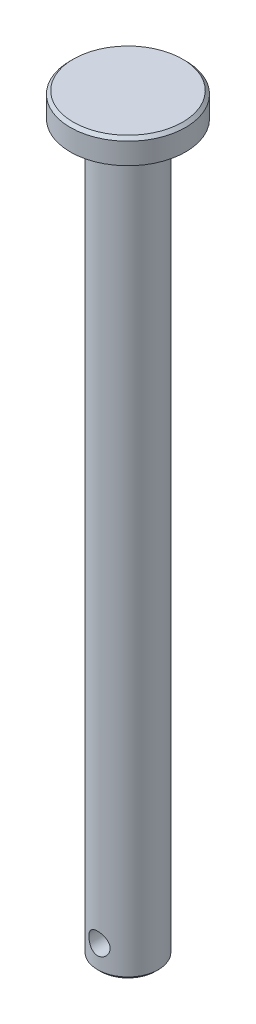
ISO-10303-21;
HEADER;
FILE_DESCRIPTION(('STEP AP214'),'2;1');
FILE_NAME('part.step','',(''),(''),'','','');
FILE_SCHEMA(('AUTOMOTIVE_DESIGN { 1 0 10303 214 1 1 1 1 }'));
ENDSEC;
DATA;
#1=APPLICATION_CONTEXT('core data for automotive mechanical design processes');
#2=APPLICATION_PROTOCOL_DEFINITION('international standard','automotive_design',2000,#1);
#3=PRODUCT_CONTEXT('',#1,'mechanical');
#4=PRODUCT('Part','Part','',(#3));
#5=PRODUCT_RELATED_PRODUCT_CATEGORY('part','',(#4));
#6=PRODUCT_DEFINITION_FORMATION('','',#4);
#7=PRODUCT_DEFINITION_CONTEXT('part definition',#1,'design');
#8=PRODUCT_DEFINITION('design','',#6,#7);
#9=PRODUCT_DEFINITION_SHAPE('','',#8);
#10=(LENGTH_UNIT() NAMED_UNIT(*) SI_UNIT(.MILLI.,.METRE.));
#11=(NAMED_UNIT(*) PLANE_ANGLE_UNIT() SI_UNIT($,.RADIAN.));
#12=(NAMED_UNIT(*) SI_UNIT($,.STERADIAN.) SOLID_ANGLE_UNIT());
#13=UNCERTAINTY_MEASURE_WITH_UNIT(LENGTH_MEASURE(1.E-05),#10,'distance_accuracy_value','');
#14=(GEOMETRIC_REPRESENTATION_CONTEXT(3) GLOBAL_UNCERTAINTY_ASSIGNED_CONTEXT((#13)) GLOBAL_UNIT_ASSIGNED_CONTEXT((#10,
#11,#12)) REPRESENTATION_CONTEXT('',''));
#15=CARTESIAN_POINT('',(0.,0.,0.));
#16=DIRECTION('',(0.,0.,1.));
#17=DIRECTION('',(1.,0.,0.));
#18=AXIS2_PLACEMENT_3D('',#15,#16,#17);
#19=CARTESIAN_POINT('',(0.,123.35,0.));
#20=DIRECTION('',(0.,-1.,0.));
#21=DIRECTION('',(0.,0.,-1.));
#22=AXIS2_PLACEMENT_3D('',#19,#20,#21);
#23=PLANE('',#22);
#24=CARTESIAN_POINT('',(0.,123.35,0.));
#25=DIRECTION('',(0.,1.,0.));
#26=DIRECTION('',(0.,0.,1.));
#27=AXIS2_PLACEMENT_3D('',#24,#25,#26);
#28=CIRCLE('',#27,18.);
#29=CARTESIAN_POINT('',(0.,123.35,18.0000000000001));
#30=VERTEX_POINT('',#29);
#31=EDGE_CURVE('E10',#30,#30,#28,.T.);
#32=ORIENTED_EDGE('',*,*,#31,.T.);
#33=EDGE_LOOP('',(#32));
#34=FACE_BOUND('',#33,.T.);
#35=ADVANCED_FACE('F37',(#34),#23,.F.);
#36=CARTESIAN_POINT('',(0.,122.35,0.));
#37=DIRECTION('',(0.,-1.,0.));
#38=DIRECTION('',(0.,0.,-1.));
#39=AXIS2_PLACEMENT_3D('',#36,#37,#38);
#40=CONICAL_SURFACE('',#39,19.,0.785398163397448);
#41=ORIENTED_EDGE('',*,*,#31,.F.);
#42=EDGE_LOOP('',(#41));
#43=FACE_BOUND('',#42,.T.);
#44=CARTESIAN_POINT('',(0.,122.35,0.));
#45=DIRECTION('',(0.,1.,0.));
#46=DIRECTION('',(0.,0.,1.));
#47=AXIS2_PLACEMENT_3D('',#44,#45,#46);
#48=CIRCLE('',#47,19.);
#49=CARTESIAN_POINT('',(0.,122.35,19.0000000000001));
#50=VERTEX_POINT('',#49);
#51=EDGE_CURVE('E49',#50,#50,#48,.T.);
#52=ORIENTED_EDGE('',*,*,#51,.T.);
#53=EDGE_LOOP('',(#52));
#54=FACE_BOUND('',#53,.T.);
#55=ADVANCED_FACE('F87',(#43,#54),#40,.T.);
#56=CARTESIAN_POINT('',(0.,123.35,0.));
#57=DIRECTION('',(0.,1.,0.));
#58=DIRECTION('',(0.,0.,1.));
#59=AXIS2_PLACEMENT_3D('',#56,#57,#58);
#60=CYLINDRICAL_SURFACE('',#59,19.);
#61=ORIENTED_EDGE('',*,*,#51,.F.);
#62=EDGE_LOOP('',(#61));
#63=FACE_BOUND('',#62,.T.);
#64=CARTESIAN_POINT('',(0.,115.35,0.));
#65=DIRECTION('',(0.,1.,0.));
#66=DIRECTION('',(0.,0.,1.));
#67=AXIS2_PLACEMENT_3D('',#64,#65,#66);
#68=CIRCLE('',#67,19.);
#69=CARTESIAN_POINT('',(0.,115.35,19.0000000000001));
#70=VERTEX_POINT('',#69);
#71=EDGE_CURVE('E54',#70,#70,#68,.T.);
#72=ORIENTED_EDGE('',*,*,#71,.T.);
#73=EDGE_LOOP('',(#72));
#74=FACE_BOUND('',#73,.T.);
#75=ADVANCED_FACE('F91',(#63,#74),#60,.T.);
#76=CARTESIAN_POINT('',(0.,115.35,-19.));
#77=DIRECTION('',(0.,1.,0.));
#78=DIRECTION('',(0.,0.,1.));
#79=AXIS2_PLACEMENT_3D('',#76,#77,#78);
#80=PLANE('',#79);
#81=ORIENTED_EDGE('',*,*,#71,.F.);
#82=EDGE_LOOP('',(#81));
#83=FACE_BOUND('',#82,.T.);
#84=CARTESIAN_POINT('',(0.,115.35,0.));
#85=DIRECTION('',(0.,1.,0.));
#86=DIRECTION('',(0.,0.,1.));
#87=AXIS2_PLACEMENT_3D('',#84,#85,#86);
#88=CIRCLE('',#87,10.);
#89=CARTESIAN_POINT('',(0.,115.35,10.0000000000001));
#90=VERTEX_POINT('',#89);
#91=EDGE_CURVE('E107',#90,#90,#88,.T.);
#92=ORIENTED_EDGE('',*,*,#91,.T.);
#93=EDGE_LOOP('',(#92));
#94=FACE_BOUND('',#93,.T.);
#95=ADVANCED_FACE('F82',(#83,#94),#80,.F.);
#96=CARTESIAN_POINT('',(0.,123.35,0.));
#97=DIRECTION('',(0.,1.,0.));
#98=DIRECTION('',(0.,0.,1.));
#99=AXIS2_PLACEMENT_3D('',#96,#97,#98);
#100=CYLINDRICAL_SURFACE('',#99,10.);
#101=CARTESIAN_POINT('',(0.,-118.35,10.0000000000001));
#102=CARTESIAN_POINT('',(-0.190419365667703,-118.350002956649,10.0000020746621));
#103=CARTESIAN_POINT('',(-0.38081762160574,-118.334410328595,9.99451197787152));
#104=CARTESIAN_POINT('',(-0.755973359168908,-118.272666206838,9.97315454250201));
#105=CARTESIAN_POINT('',(-0.940730815616032,-118.226514576755,9.95728715761059));
#106=CARTESIAN_POINT('',(-1.29914235601609,-118.105451061498,9.91689126922372));
#107=CARTESIAN_POINT('',(-1.47281549375808,-118.030590170228,9.89237812863989));
#108=CARTESIAN_POINT('',(-1.80513664529484,-117.854474888736,9.83716899731461));
#109=CARTESIAN_POINT('',(-1.96378123246314,-117.753214498877,9.80647160147961));
#110=CARTESIAN_POINT('',(-2.26752589205325,-117.523171484349,9.74080617360312));
#111=CARTESIAN_POINT('',(-2.41198196476038,-117.393570081778,9.70572841777014));
#112=CARTESIAN_POINT('',(-2.67761185151262,-117.112263331053,9.63583394944028));
#113=CARTESIAN_POINT('',(-2.79877980873016,-116.960552439313,9.60101730472151));
#114=CARTESIAN_POINT('',(-3.01822956436078,-116.633345350441,9.53435354213106));
#115=CARTESIAN_POINT('',(-3.11564633061597,-116.45723944154,9.50263856119584));
#116=CARTESIAN_POINT('',(-3.27919932284536,-116.089855409709,9.44745244346266));
#117=CARTESIAN_POINT('',(-3.34534622118704,-115.898582489326,9.42397849471551));
#118=CARTESIAN_POINT('',(-3.442016393275,-115.513656967317,9.38909436352048));
#119=CARTESIAN_POINT('',(-3.47375567154242,-115.320348102858,9.37727382728356));
#120=CARTESIAN_POINT('',(-3.5045119777418,-114.930814881086,9.36582571885885));
#121=CARTESIAN_POINT('',(-3.50354037655207,-114.734591560598,9.36619390965393));
#122=CARTESIAN_POINT('',(-3.46984099899521,-114.355450541086,9.37872426808744));
#123=CARTESIAN_POINT('',(-3.43873715098197,-114.172365019623,9.39028330321848));
#124=CARTESIAN_POINT('',(-3.34831908308157,-113.814197593617,9.42290004435321));
#125=CARTESIAN_POINT('',(-3.2890011577967,-113.639116743653,9.44395899797692));
#126=CARTESIAN_POINT('',(-3.14284371093642,-113.298387633251,9.49360610743072));
#127=CARTESIAN_POINT('',(-3.05554665446728,-113.13295444866,9.52231799264184));
#128=CARTESIAN_POINT('',(-2.8562268850267,-112.818588051007,9.58398812877159));
#129=CARTESIAN_POINT('',(-2.74419646122599,-112.669660005354,9.61694770260504));
#130=CARTESIAN_POINT('',(-2.49093399518728,-112.383456771633,9.68573241314932));
#131=CARTESIAN_POINT('',(-2.34838607842094,-112.247356750452,9.72161293244879));
#132=CARTESIAN_POINT('',(-2.04205684725532,-112.00067012811,9.79053740803585));
#133=CARTESIAN_POINT('',(-1.87827306050323,-111.890086501829,9.82358103329678));
#134=CARTESIAN_POINT('',(-1.53143472911856,-111.696494008746,9.88362313366396));
#135=CARTESIAN_POINT('',(-1.34817380341042,-111.613829437555,9.91054487994613));
#136=CARTESIAN_POINT('',(-0.969175142974263,-111.480877693133,9.95474882353592));
#137=CARTESIAN_POINT('',(-0.773442238836897,-111.430578067228,9.97203472796913));
#138=CARTESIAN_POINT('',(-0.384982043681423,-111.365934186578,9.99439060162877));
#139=CARTESIAN_POINT('',(-0.192549298627005,-111.350004193481,9.99999889165438));
#140=CARTESIAN_POINT('',(0.192296486438431,-111.349995810658,10.0000011069649));
#141=CARTESIAN_POINT('',(0.384709523316249,-111.36591141143,9.99439714808528));
#142=CARTESIAN_POINT('',(0.757512294713571,-111.427905349904,9.97296032320407));
#143=CARTESIAN_POINT('',(0.938089527398881,-111.472985137734,9.95746630824318));
#144=CARTESIAN_POINT('',(1.28902504417686,-111.590753814901,9.9181459010926));
#145=CARTESIAN_POINT('',(1.45938200269866,-111.663446276679,9.89431843077806));
#146=CARTESIAN_POINT('',(1.790306794606,-111.836590088631,9.83990425287687));
#147=CARTESIAN_POINT('',(1.95047324127449,-111.937753984704,9.80914873431535));
#148=CARTESIAN_POINT('',(2.25205778758365,-112.164145179573,9.74433517467026));
#149=CARTESIAN_POINT('',(2.39346963572598,-112.289380468224,9.71027603890417));
#150=CARTESIAN_POINT('',(2.66095315380392,-112.567800201614,9.64050839724215));
#151=CARTESIAN_POINT('',(2.7858945116179,-112.722074107977,9.60480315581253));
#152=CARTESIAN_POINT('',(3.00828742625728,-113.0501458994,9.53749178690702));
#153=CARTESIAN_POINT('',(3.10573801857336,-113.223944469181,9.50588580327396));
#154=CARTESIAN_POINT('',(3.27010981479248,-113.586667290207,9.4506055494948));
#155=CARTESIAN_POINT('',(3.33703039732226,-113.775591849218,9.42693144078769));
#156=CARTESIAN_POINT('',(3.43775166187451,-114.163065453886,9.39067542064758));
#157=CARTESIAN_POINT('',(3.47156933803391,-114.361609506153,9.37808781803521));
#158=CARTESIAN_POINT('',(3.50371939295706,-114.750620321542,9.36612061036581));
#159=CARTESIAN_POINT('',(3.50394730780741,-114.940910296685,9.36603546801151));
#160=CARTESIAN_POINT('',(3.47365100022855,-115.318662623158,9.37731326834135));
#161=CARTESIAN_POINT('',(3.44312898727853,-115.506125176664,9.38867538850361));
#162=CARTESIAN_POINT('',(3.35359653138477,-115.868550958743,9.42101694008909));
#163=CARTESIAN_POINT('',(3.29526105722089,-116.04370296668,9.44176794542056));
#164=CARTESIAN_POINT('',(3.15232119578642,-116.381858094807,9.49044489662172));
#165=CARTESIAN_POINT('',(3.0677106267727,-116.544858344848,9.51837253067028));
#166=CARTESIAN_POINT('',(2.86997020698606,-116.862434575392,9.5798987569115));
#167=CARTESIAN_POINT('',(2.75568240723705,-117.016249400201,9.61370284993353));
#168=CARTESIAN_POINT('',(2.50372401134065,-117.303127628683,9.68237561466651));
#169=CARTESIAN_POINT('',(2.36604648644048,-117.436184860852,9.71724459931314));
#170=CARTESIAN_POINT('',(2.0638531650368,-117.683783781714,9.78598669527189));
#171=CARTESIAN_POINT('',(1.89841397862823,-117.797234450509,9.81974595569719));
#172=CARTESIAN_POINT('',(1.54966762908333,-117.99462349528,9.88078026171577));
#173=CARTESIAN_POINT('',(1.36636283652995,-118.078565779924,9.90805616593685));
#174=CARTESIAN_POINT('',(0.989029837726598,-118.213257219041,9.95276281016505));
#175=CARTESIAN_POINT('',(0.795139546253167,-118.26435660857,9.97029715080668));
#176=CARTESIAN_POINT('',(0.400823491605332,-118.332720485005,9.99391263716047));
#177=CARTESIAN_POINT('',(0.200400055490109,-118.34999688838,9.99999781659617));
#178=CARTESIAN_POINT('',(0.,-118.35,10.0000000000001));
#179=B_SPLINE_CURVE_WITH_KNOTS('',3,(#101,#102,#103,#104,#105,#106,#107,#108,#109,#110,#111,
#112,#113,#114,#115,#116,#117,#118,#119,#120,#121,#122,#123,#124,#125,#126,#127,#128,#129,#130,
#131,#132,#133,#134,#135,#136,#137,#138,#139,#140,#141,#142,#143,#144,#145,#146,#147,#148,#149,
#150,#151,#152,#153,#154,#155,#156,#157,#158,#159,#160,#161,#162,#163,#164,#165,#166,#167,#168,
#169,#170,#171,#172,#173,#174,#175,#176,#177,#178),.UNSPECIFIED.,.T.,.F.,(4,2,2,2,2,2,2,2,2,2,2,
2,2,2,2,2,2,2,2,2,2,2,2,2,2,2,2,2,2,2,2,2,2,2,2,2,2,2,4),(0.,0.570519944031418,1.14104243423654,
1.71055621088201,2.28019953012127,2.86921290102946,3.45837421214186,4.06655384480433,
4.67452575637786,5.26023033916308,5.84573132281353,6.40133800538017,6.95701767677413,
7.5222923800419,8.08774356179833,8.68595781382783,9.28424177465472,9.88965514245499,
10.4948354330496,11.0714375543579,11.6479308767879,12.2056613710878,12.7634640474098,
13.336703777142,13.9101341080364,14.5124257563887,15.1147385334242,15.7170635687055,
16.319079224177,16.8871081579754,17.4550962800157,18.0099524936405,18.5649393473461,
19.1461307089424,19.7274945383823,20.3347978040911,20.9420205963009,21.542655573071,
22.143078896829),.UNSPECIFIED.);
#180=CARTESIAN_POINT('',(0.,-118.35,10.0000000000001));
#181=VERTEX_POINT('',#180);
#182=EDGE_CURVE('E40',#181,#181,#179,.T.);
#183=ORIENTED_EDGE('',*,*,#182,.T.);
#184=EDGE_LOOP('',(#183));
#185=FACE_BOUND('',#184,.T.);
#186=CARTESIAN_POINT('',(3.5,-114.85,-9.36749699759761));
#187=CARTESIAN_POINT('',(3.50000305653412,-114.659984771557,-9.36749440971919));
#188=CARTESIAN_POINT('',(3.48447405691784,-114.469990833718,-9.37334161385507));
#189=CARTESIAN_POINT('',(3.42300568686183,-114.095670773122,-9.39596107926461));
#190=CARTESIAN_POINT('',(3.37706378968547,-113.911345122623,-9.41273424827747));
#191=CARTESIAN_POINT('',(3.25661257103421,-113.553853316391,-9.45507797616444));
#192=CARTESIAN_POINT('',(3.18216395043216,-113.380664355695,-9.48062983032267));
#193=CARTESIAN_POINT('',(3.00702321848339,-113.049173232595,-9.537623564291));
#194=CARTESIAN_POINT('',(2.90632443475545,-112.89087486909,-9.56906694106175));
#195=CARTESIAN_POINT('',(2.67688293965062,-112.586821383217,-9.63582342492188));
#196=CARTESIAN_POINT('',(2.54719487518731,-112.441802156163,-9.67123996185277));
#197=CARTESIAN_POINT('',(2.26546916251154,-112.175062505967,-9.74108253834276));
#198=CARTESIAN_POINT('',(2.11342750418821,-112.053346272292,-9.77550839885224));
#199=CARTESIAN_POINT('',(1.78585018605226,-111.83324987108,-9.84070055714599));
#200=CARTESIAN_POINT('',(1.60975957407365,-111.735651909924,-9.87133119900492));
#201=CARTESIAN_POINT('',(1.2424014342135,-111.571760382251,-9.9242536024426));
#202=CARTESIAN_POINT('',(1.05113846528143,-111.505457453592,-9.94654785749863));
#203=CARTESIAN_POINT('',(0.666588882256222,-111.408566422524,-9.97955234395668));
#204=CARTESIAN_POINT('',(0.473656238100808,-111.376715254948,-9.99067110510591));
#205=CARTESIAN_POINT('',(0.0848856021438181,-111.345603824681,-10.0015281495066));
#206=CARTESIAN_POINT('',(-0.110951549876003,-111.346334318445,-10.0012696605286));
#207=CARTESIAN_POINT('',(-0.490988541369924,-111.379589616345,-9.98967164690015));
#208=CARTESIAN_POINT('',(-0.675325714390918,-111.410740030338,-9.97881113553876));
#209=CARTESIAN_POINT('',(-1.03596846192583,-111.501663027923,-9.9478411735745));
#210=CARTESIAN_POINT('',(-1.21227347889997,-111.561437595111,-9.92773108199803));
#211=CARTESIAN_POINT('',(-1.55471483181771,-111.708649303211,-9.87993869693849));
#212=CARTESIAN_POINT('',(-1.72067758348001,-111.796456252002,-9.85215588578905));
#213=CARTESIAN_POINT('',(-2.03590117401332,-111.996927453325,-9.79187924104223));
#214=CARTESIAN_POINT('',(-2.18515703205792,-112.109599089175,-9.75938400912388));
#215=CARTESIAN_POINT('',(-2.47087991906561,-112.363412146894,-9.69110123269399));
#216=CARTESIAN_POINT('',(-2.60629061174074,-112.505722035027,-9.65523032328997));
#217=CARTESIAN_POINT('',(-2.85168878385785,-112.811303983782,-9.58562363211352));
#218=CARTESIAN_POINT('',(-2.96167146390529,-112.974579992611,-9.55188825428184));
#219=CARTESIAN_POINT('',(-3.15476153205294,-113.321120069064,-9.48988823258128));
#220=CARTESIAN_POINT('',(-3.23737626942263,-113.504678622808,-9.46172720245545));
#221=CARTESIAN_POINT('',(-3.37014757433805,-113.884341348301,-9.41525954321772));
#222=CARTESIAN_POINT('',(-3.42031943737438,-114.080439560122,-9.39694827103281));
#223=CARTESIAN_POINT('',(-3.48453330621147,-114.469296749614,-9.37332105969715));
#224=CARTESIAN_POINT('',(-3.50022937268545,-114.661746397617,-9.36741082166474));
#225=CARTESIAN_POINT('',(-3.49976567675266,-115.0465791605,-9.36758502312182));
#226=CARTESIAN_POINT('',(-3.48361248881526,-115.238962280913,-9.3736669871259));
#227=CARTESIAN_POINT('',(-3.42140083953763,-115.610318118364,-9.39654335530695));
#228=CARTESIAN_POINT('',(-3.37654009447338,-115.789520866927,-9.41290826782189));
#229=CARTESIAN_POINT('',(-3.25965068720098,-116.137803068957,-9.45401972645323));
#230=CARTESIAN_POINT('',(-3.18761690701554,-116.306880608409,-9.47876785143837));
#231=CARTESIAN_POINT('',(-3.01564515483387,-116.636509444171,-9.53489951676247));
#232=CARTESIAN_POINT('',(-2.91483956950775,-116.79657352837,-9.5664805133946));
#233=CARTESIAN_POINT('',(-2.68914500633046,-117.098108448564,-9.63235686963823));
#234=CARTESIAN_POINT('',(-2.56424824219257,-117.23957324833,-9.66665310469827));
#235=CARTESIAN_POINT('',(-2.28593247448553,-117.507787285424,-9.73633119025962));
#236=CARTESIAN_POINT('',(-2.13133888493012,-117.633332192644,-9.77167190229907));
#237=CARTESIAN_POINT('',(-1.80240593612249,-117.856801802658,-9.83765372828227));
#238=CARTESIAN_POINT('',(-1.62806703575054,-117.954727147145,-9.86829495140302));
#239=CARTESIAN_POINT('',(-1.26521616343171,-118.119354260888,-9.92132136236446));
#240=CARTESIAN_POINT('',(-1.07679004536619,-118.186229710326,-9.94375232187575));
#241=CARTESIAN_POINT('',(-0.69041475006938,-118.287025580968,-9.97801936827268));
#242=CARTESIAN_POINT('',(-0.492469439318236,-118.320959265675,-9.9898597191557));
#243=CARTESIAN_POINT('',(-0.103636883752354,-118.353620412604,-10.0012572973375));
#244=CARTESIAN_POINT('',(0.0870896347606785,-118.354069128472,-10.0014150508395));
#245=CARTESIAN_POINT('',(0.465775073928701,-118.324063903752,-9.99094200420206));
#246=CARTESIAN_POINT('',(0.653734257414448,-118.293612917358,-9.98031223541339));
#247=CARTESIAN_POINT('',(1.01796363940983,-118.203845308134,-9.94970123167976));
#248=CARTESIAN_POINT('',(1.19438805946025,-118.145088020167,-9.92990147780882));
#249=CARTESIAN_POINT('',(1.53492402713974,-118.000907290156,-9.8829947150704));
#250=CARTESIAN_POINT('',(1.69903327861285,-117.915478890544,-9.85588634782217));
#251=CARTESIAN_POINT('',(2.01730058632864,-117.716545617038,-9.79580321695775));
#252=CARTESIAN_POINT('',(2.17081712673076,-117.60207211901,-9.76264026908024));
#253=CARTESIAN_POINT('',(2.45701356107973,-117.349897334374,-9.69457389820949));
#254=CARTESIAN_POINT('',(2.58968644353593,-117.21218826384,-9.65966989473118));
#255=CARTESIAN_POINT('',(2.83644297052622,-116.910162909785,-9.59019121590671));
#256=CARTESIAN_POINT('',(2.94944096028681,-116.744937333913,-9.55569982961206));
#257=CARTESIAN_POINT('',(3.1460305199825,-116.396752285684,-9.49279689390618));
#258=CARTESIAN_POINT('',(3.22962589570285,-116.213795112364,-9.46438455782774));
#259=CARTESIAN_POINT('',(3.36376834113852,-115.837195703062,-9.41754204054604));
#260=CARTESIAN_POINT('',(3.41467143953433,-115.643694373451,-9.39900471032416));
#261=CARTESIAN_POINT('',(3.48277809330472,-115.250118834674,-9.37398625810593));
#262=CARTESIAN_POINT('',(3.49999678208754,-115.050047618262,-9.36749972211036));
#263=CARTESIAN_POINT('',(3.5,-114.85,-9.36749699759761));
#264=B_SPLINE_CURVE_WITH_KNOTS('',3,(#186,#187,#188,#189,#190,#191,#192,#193,#194,#195,#196,
#197,#198,#199,#200,#201,#202,#203,#204,#205,#206,#207,#208,#209,#210,#211,#212,#213,#214,#215,
#216,#217,#218,#219,#220,#221,#222,#223,#224,#225,#226,#227,#228,#229,#230,#231,#232,#233,#234,
#235,#236,#237,#238,#239,#240,#241,#242,#243,#244,#245,#246,#247,#248,#249,#250,#251,#252,#253,
#254,#255,#256,#257,#258,#259,#260,#261,#262,#263),.UNSPECIFIED.,.T.,.F.,(4,2,2,2,2,2,2,2,2,2,2,
2,2,2,2,2,2,2,2,2,2,2,2,2,2,2,2,2,2,2,2,2,2,2,2,2,2,2,4),(0.,0.569303271188394,1.13865384664941,
1.7067987558077,2.27508821957678,2.86567632067939,3.45637049958399,4.06425497293887,
4.671957477662,5.25653473089017,5.84094613832785,6.40011991303918,6.95933244298441,
7.52625023609968,8.09333659677847,8.68966509904167,9.28610606324157,9.89276413906805,
10.499135991446,11.0757147838072,11.6521745685868,12.2060258875446,12.7599815752237,
13.3328233448281,13.9058505684788,14.5097673315547,15.1136700625062,15.7141528622371,
16.3143937862434,16.8837576246019,17.4530670335451,18.0115615554684,18.5701599509704,
19.1506370908609,19.7313090782975,20.3377389331389,20.9440902646265,21.5437209656749,
22.1430822084723),.UNSPECIFIED.);
#265=CARTESIAN_POINT('',(3.5,-114.85,-9.36749699759761));
#266=VERTEX_POINT('',#265);
#267=EDGE_CURVE('E57',#266,#266,#264,.T.);
#268=ORIENTED_EDGE('',*,*,#267,.T.);
#269=EDGE_LOOP('',(#268));
#270=FACE_BOUND('',#269,.T.);
#271=ORIENTED_EDGE('',*,*,#91,.F.);
#272=EDGE_LOOP('',(#271));
#273=FACE_BOUND('',#272,.T.);
#274=CARTESIAN_POINT('',(0.,-122.35,0.));
#275=DIRECTION('',(0.,1.,0.));
#276=DIRECTION('',(0.,0.,1.));
#277=AXIS2_PLACEMENT_3D('',#274,#275,#276);
#278=CIRCLE('',#277,10.0000000000001);
#279=CARTESIAN_POINT('',(0.,-122.35,10.0000000000001));
#280=VERTEX_POINT('',#279);
#281=EDGE_CURVE('E109',#280,#280,#278,.T.);
#282=ORIENTED_EDGE('',*,*,#281,.T.);
#283=EDGE_LOOP('',(#282));
#284=FACE_BOUND('',#283,.T.);
#285=ADVANCED_FACE('F62',(#185,#270,#273,#284),#100,.T.);
#286=CARTESIAN_POINT('',(0.,-123.35,0.));
#287=DIRECTION('',(0.,1.,0.));
#288=DIRECTION('',(0.,0.,1.));
#289=AXIS2_PLACEMENT_3D('',#286,#287,#288);
#290=CONICAL_SURFACE('',#289,9.00000000000006,0.785398163397449);
#291=ORIENTED_EDGE('',*,*,#281,.F.);
#292=EDGE_LOOP('',(#291));
#293=FACE_BOUND('',#292,.T.);
#294=CARTESIAN_POINT('',(0.,-123.35,0.));
#295=DIRECTION('',(0.,1.,0.));
#296=DIRECTION('',(0.,0.,1.));
#297=AXIS2_PLACEMENT_3D('',#294,#295,#296);
#298=CIRCLE('',#297,9.00000000000006);
#299=CARTESIAN_POINT('',(0.,-123.35,9.00000000000009));
#300=VERTEX_POINT('',#299);
#301=EDGE_CURVE('E112',#300,#300,#298,.T.);
#302=ORIENTED_EDGE('',*,*,#301,.T.);
#303=EDGE_LOOP('',(#302));
#304=FACE_BOUND('',#303,.T.);
#305=ADVANCED_FACE('F74',(#293,#304),#290,.T.);
#306=CARTESIAN_POINT('',(0.,-123.35,-9.00000000000002));
#307=DIRECTION('',(0.,1.,0.));
#308=DIRECTION('',(0.,0.,1.));
#309=AXIS2_PLACEMENT_3D('',#306,#307,#308);
#310=PLANE('',#309);
#311=ORIENTED_EDGE('',*,*,#301,.F.);
#312=EDGE_LOOP('',(#311));
#313=FACE_BOUND('',#312,.T.);
#314=ADVANCED_FACE('F70',(#313),#310,.F.);
#315=CARTESIAN_POINT('',(0.,-114.85,-19.));
#316=DIRECTION('',(0.,0.,1.));
#317=DIRECTION('',(1.,0.,0.));
#318=AXIS2_PLACEMENT_3D('',#315,#316,#317);
#319=CYLINDRICAL_SURFACE('',#318,3.5);
#320=ORIENTED_EDGE('',*,*,#267,.F.);
#321=EDGE_LOOP('',(#320));
#322=FACE_BOUND('',#321,.T.);
#323=ORIENTED_EDGE('',*,*,#182,.F.);
#324=EDGE_LOOP('',(#323));
#325=FACE_BOUND('',#324,.T.);
#326=ADVANCED_FACE('F66',(#322,#325),#319,.F.);
#327=CLOSED_SHELL('',(#35,#55,#75,#95,#285,#305,#314,#326));
#328=MANIFOLD_SOLID_BREP('B2',#327);
#329=ADVANCED_BREP_SHAPE_REPRESENTATION('',(#18,#328),#14);
#330=SHAPE_DEFINITION_REPRESENTATION(#9,#329);
ENDSEC;
END-ISO-10303-21;
